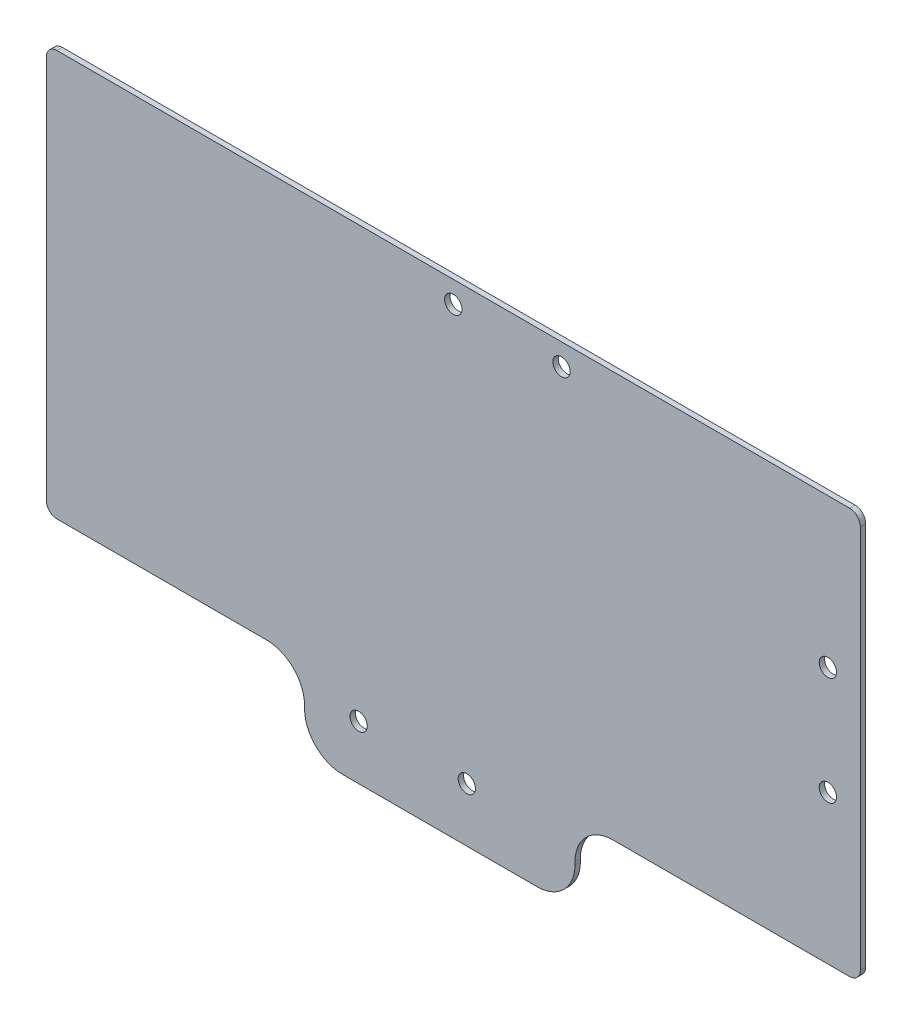
ISO-10303-21;
HEADER;
FILE_DESCRIPTION(('STEP AP214'),'2;1');
FILE_NAME('part.step','',(''),(''),'','','');
FILE_SCHEMA(('AUTOMOTIVE_DESIGN { 1 0 10303 214 1 1 1 1 }'));
ENDSEC;
DATA;
#1=APPLICATION_CONTEXT('core data for automotive mechanical design processes');
#2=APPLICATION_PROTOCOL_DEFINITION('international standard','automotive_design',2000,#1);
#3=PRODUCT_CONTEXT('',#1,'mechanical');
#4=PRODUCT('Part','Part','',(#3));
#5=PRODUCT_RELATED_PRODUCT_CATEGORY('part','',(#4));
#6=PRODUCT_DEFINITION_FORMATION('','',#4);
#7=PRODUCT_DEFINITION_CONTEXT('part definition',#1,'design');
#8=PRODUCT_DEFINITION('design','',#6,#7);
#9=PRODUCT_DEFINITION_SHAPE('','',#8);
#10=(LENGTH_UNIT() NAMED_UNIT(*) SI_UNIT(.MILLI.,.METRE.));
#11=(NAMED_UNIT(*) PLANE_ANGLE_UNIT() SI_UNIT($,.RADIAN.));
#12=(NAMED_UNIT(*) SI_UNIT($,.STERADIAN.) SOLID_ANGLE_UNIT());
#13=UNCERTAINTY_MEASURE_WITH_UNIT(LENGTH_MEASURE(1.E-05),#10,'distance_accuracy_value','');
#14=(GEOMETRIC_REPRESENTATION_CONTEXT(3) GLOBAL_UNCERTAINTY_ASSIGNED_CONTEXT((#13)) GLOBAL_UNIT_ASSIGNED_CONTEXT((#10,
#11,#12)) REPRESENTATION_CONTEXT('',''));
#15=CARTESIAN_POINT('',(0.,0.,0.));
#16=DIRECTION('',(0.,0.,1.));
#17=DIRECTION('',(1.,0.,0.));
#18=AXIS2_PLACEMENT_3D('',#15,#16,#17);
#19=CARTESIAN_POINT('',(0.,0.,1.));
#20=DIRECTION('',(0.,0.,-1.));
#21=DIRECTION('',(-1.,0.,0.));
#22=AXIS2_PLACEMENT_3D('',#19,#20,#21);
#23=PLANE('',#22);
#24=CARTESIAN_POINT('',(27.5,75.5,0.999999999999999));
#25=DIRECTION('',(0.,0.,-1.));
#26=DIRECTION('',(-1.,0.,0.));
#27=AXIS2_PLACEMENT_3D('',#24,#25,#26);
#28=CIRCLE('',#27,1.60000000000001);
#29=CARTESIAN_POINT('',(25.9,75.5,0.999999999999999));
#30=VERTEX_POINT('',#29);
#31=EDGE_CURVE('E355',#30,#30,#28,.T.);
#32=ORIENTED_EDGE('',*,*,#31,.T.);
#33=EDGE_LOOP('',(#32));
#34=FACE_BOUND('',#33,.T.);
#35=CARTESIAN_POINT('',(7.49999999999999,75.5,0.999999999999999));
#36=DIRECTION('',(0.,0.,-1.));
#37=DIRECTION('',(-1.,0.,0.));
#38=AXIS2_PLACEMENT_3D('',#35,#36,#37);
#39=CIRCLE('',#38,1.6);
#40=CARTESIAN_POINT('',(5.89999999999999,75.5,0.999999999999999));
#41=VERTEX_POINT('',#40);
#42=EDGE_CURVE('E359',#41,#41,#39,.T.);
#43=ORIENTED_EDGE('',*,*,#42,.T.);
#44=EDGE_LOOP('',(#43));
#45=FACE_BOUND('',#44,.T.);
#46=DIRECTION('',(0.,-1.,0.));
#47=VECTOR('',#46,1.);
#48=CARTESIAN_POINT('',(-67.75,79.5,1.));
#49=LINE('',#48,#47);
#50=CARTESIAN_POINT('',(-67.75,77.5,1.));
#51=VERTEX_POINT('',#50);
#52=CARTESIAN_POINT('',(-67.75,6.50000000000001,1.));
#53=VERTEX_POINT('',#52);
#54=EDGE_CURVE('E366',#51,#53,#49,.T.);
#55=ORIENTED_EDGE('',*,*,#54,.T.);
#56=CARTESIAN_POINT('',(-65.75,6.5,1.));
#57=DIRECTION('',(0.,0.,-1.));
#58=DIRECTION('',(-1.,0.,0.));
#59=AXIS2_PLACEMENT_3D('',#56,#57,#58);
#60=CIRCLE('',#59,2.);
#61=CARTESIAN_POINT('',(-65.75,4.5,1.));
#62=VERTEX_POINT('',#61);
#63=EDGE_CURVE('E236',#53,#62,#60,.F.);
#64=ORIENTED_EDGE('',*,*,#63,.T.);
#65=DIRECTION('',(-1.,0.,0.));
#66=VECTOR('',#65,1.);
#67=CARTESIAN_POINT('',(82.75,4.5,1.));
#68=LINE('',#67,#66);
#69=CARTESIAN_POINT('',(-27.,4.5,1.));
#70=VERTEX_POINT('',#69);
#71=EDGE_CURVE('E258',#70,#62,#68,.T.);
#72=ORIENTED_EDGE('',*,*,#71,.F.);
#73=CARTESIAN_POINT('',(-27.,-2.5,0.999999999999999));
#74=DIRECTION('',(0.,0.,-1.));
#75=DIRECTION('',(-1.,0.,0.));
#76=AXIS2_PLACEMENT_3D('',#73,#74,#75);
#77=CIRCLE('',#76,7.);
#78=CARTESIAN_POINT('',(-20.,-2.5,1.));
#79=VERTEX_POINT('',#78);
#80=EDGE_CURVE('E213',#70,#79,#77,.T.);
#81=ORIENTED_EDGE('',*,*,#80,.T.);
#82=DIRECTION('',(0.,-1.,0.));
#83=VECTOR('',#82,1.);
#84=CARTESIAN_POINT('',(-20.,0.,1.));
#85=LINE('',#84,#83);
#86=CARTESIAN_POINT('',(-20.,-3.,1.));
#87=VERTEX_POINT('',#86);
#88=EDGE_CURVE('E289',#79,#87,#85,.T.);
#89=ORIENTED_EDGE('',*,*,#88,.T.);
#90=CARTESIAN_POINT('',(-13.,-3.,1.));
#91=DIRECTION('',(0.,0.,-1.));
#92=DIRECTION('',(-1.,0.,0.));
#93=AXIS2_PLACEMENT_3D('',#90,#91,#92);
#94=CIRCLE('',#93,7.);
#95=CARTESIAN_POINT('',(-13.,-10.,1.));
#96=VERTEX_POINT('',#95);
#97=EDGE_CURVE('E207',#87,#96,#94,.F.);
#98=ORIENTED_EDGE('',*,*,#97,.T.);
#99=DIRECTION('',(1.,0.,0.));
#100=VECTOR('',#99,1.);
#101=CARTESIAN_POINT('',(-30.,-10.,1.));
#102=LINE('',#101,#100);
#103=CARTESIAN_POINT('',(23.,-10.,1.));
#104=VERTEX_POINT('',#103);
#105=EDGE_CURVE('E183',#96,#104,#102,.T.);
#106=ORIENTED_EDGE('',*,*,#105,.T.);
#107=CARTESIAN_POINT('',(23.,-3.,1.));
#108=DIRECTION('',(0.,0.,-1.));
#109=DIRECTION('',(-1.,0.,0.));
#110=AXIS2_PLACEMENT_3D('',#107,#108,#109);
#111=CIRCLE('',#110,7.);
#112=CARTESIAN_POINT('',(30.,-3.,1.));
#113=VERTEX_POINT('',#112);
#114=EDGE_CURVE('E188',#104,#113,#111,.F.);
#115=ORIENTED_EDGE('',*,*,#114,.T.);
#116=DIRECTION('',(0.,1.,0.));
#117=VECTOR('',#116,1.);
#118=CARTESIAN_POINT('',(30.,-10.,1.));
#119=LINE('',#118,#117);
#120=CARTESIAN_POINT('',(30.,-2.5,1.));
#121=VERTEX_POINT('',#120);
#122=EDGE_CURVE('E167',#113,#121,#119,.T.);
#123=ORIENTED_EDGE('',*,*,#122,.T.);
#124=CARTESIAN_POINT('',(37.,-2.5,1.));
#125=DIRECTION('',(0.,0.,-1.));
#126=DIRECTION('',(-1.,0.,0.));
#127=AXIS2_PLACEMENT_3D('',#124,#125,#126);
#128=CIRCLE('',#127,7.);
#129=CARTESIAN_POINT('',(37.,4.5,1.));
#130=VERTEX_POINT('',#129);
#131=EDGE_CURVE('E194',#121,#130,#128,.T.);
#132=ORIENTED_EDGE('',*,*,#131,.T.);
#133=CARTESIAN_POINT('',(80.75,4.5,1.));
#134=VERTEX_POINT('',#133);
#135=EDGE_CURVE('E330',#134,#130,#68,.T.);
#136=ORIENTED_EDGE('',*,*,#135,.F.);
#137=CARTESIAN_POINT('',(80.75,6.5,1.));
#138=DIRECTION('',(0.,0.,-1.));
#139=DIRECTION('',(-1.,0.,0.));
#140=AXIS2_PLACEMENT_3D('',#137,#138,#139);
#141=CIRCLE('',#140,2.);
#142=CARTESIAN_POINT('',(82.75,6.5,1.));
#143=VERTEX_POINT('',#142);
#144=EDGE_CURVE('E234',#134,#143,#141,.F.);
#145=ORIENTED_EDGE('',*,*,#144,.T.);
#146=DIRECTION('',(0.,-1.,0.));
#147=VECTOR('',#146,1.);
#148=CARTESIAN_POINT('',(82.75,4.5,1.));
#149=LINE('',#148,#147);
#150=CARTESIAN_POINT('',(82.75,77.5,1.));
#151=VERTEX_POINT('',#150);
#152=EDGE_CURVE('E254',#151,#143,#149,.T.);
#153=ORIENTED_EDGE('',*,*,#152,.F.);
#154=CARTESIAN_POINT('',(80.75,77.5,1.));
#155=DIRECTION('',(0.,0.,-1.));
#156=DIRECTION('',(-1.,0.,0.));
#157=AXIS2_PLACEMENT_3D('',#154,#155,#156);
#158=CIRCLE('',#157,2.);
#159=CARTESIAN_POINT('',(80.75,79.5,1.));
#160=VERTEX_POINT('',#159);
#161=EDGE_CURVE('E50',#151,#160,#158,.F.);
#162=ORIENTED_EDGE('',*,*,#161,.T.);
#163=DIRECTION('',(1.,0.,0.));
#164=VECTOR('',#163,1.);
#165=CARTESIAN_POINT('',(82.75,79.5,1.));
#166=LINE('',#165,#164);
#167=CARTESIAN_POINT('',(-65.75,79.5,1.));
#168=VERTEX_POINT('',#167);
#169=EDGE_CURVE('E249',#168,#160,#166,.T.);
#170=ORIENTED_EDGE('',*,*,#169,.F.);
#171=CARTESIAN_POINT('',(-65.75,77.5,1.));
#172=DIRECTION('',(0.,0.,-1.));
#173=DIRECTION('',(-1.,0.,0.));
#174=AXIS2_PLACEMENT_3D('',#171,#172,#173);
#175=CIRCLE('',#174,2.);
#176=EDGE_CURVE('E232',#168,#51,#175,.F.);
#177=ORIENTED_EDGE('',*,*,#176,.T.);
#178=EDGE_LOOP('',(#55,#64,#72,#81,#89,#98,#106,#115,#123,#132,#136,#145,#153,#162,#170,#177));
#179=FACE_BOUND('',#178,.T.);
#180=CARTESIAN_POINT('',(-10.,0.,1.));
#181=DIRECTION('',(0.,0.,1.));
#182=DIRECTION('',(1.,0.,0.));
#183=AXIS2_PLACEMENT_3D('',#180,#181,#182);
#184=CIRCLE('',#183,1.6);
#185=CARTESIAN_POINT('',(-8.4,0.,1.));
#186=VERTEX_POINT('',#185);
#187=EDGE_CURVE('E176',#186,#186,#184,.T.);
#188=ORIENTED_EDGE('',*,*,#187,.F.);
#189=EDGE_LOOP('',(#188));
#190=FACE_BOUND('',#189,.T.);
#191=CARTESIAN_POINT('',(10.,0.,1.));
#192=DIRECTION('',(0.,0.,1.));
#193=DIRECTION('',(1.,0.,0.));
#194=AXIS2_PLACEMENT_3D('',#191,#192,#193);
#195=CIRCLE('',#194,1.6);
#196=CARTESIAN_POINT('',(11.6,0.,1.));
#197=VERTEX_POINT('',#196);
#198=EDGE_CURVE('E264',#197,#197,#195,.T.);
#199=ORIENTED_EDGE('',*,*,#198,.F.);
#200=EDGE_LOOP('',(#199));
#201=FACE_BOUND('',#200,.T.);
#202=CARTESIAN_POINT('',(76.75,32.,1.));
#203=DIRECTION('',(0.,0.,-1.));
#204=DIRECTION('',(-1.,0.,0.));
#205=AXIS2_PLACEMENT_3D('',#202,#203,#204);
#206=CIRCLE('',#205,1.60000000000001);
#207=CARTESIAN_POINT('',(75.15,32.,1.));
#208=VERTEX_POINT('',#207);
#209=EDGE_CURVE('E350',#208,#208,#206,.T.);
#210=ORIENTED_EDGE('',*,*,#209,.T.);
#211=EDGE_LOOP('',(#210));
#212=FACE_BOUND('',#211,.T.);
#213=CARTESIAN_POINT('',(76.75,52.,1.));
#214=DIRECTION('',(0.,0.,-1.));
#215=DIRECTION('',(-1.,0.,0.));
#216=AXIS2_PLACEMENT_3D('',#213,#214,#215);
#217=CIRCLE('',#216,1.60000000000001);
#218=CARTESIAN_POINT('',(75.15,52.,1.));
#219=VERTEX_POINT('',#218);
#220=EDGE_CURVE('E343',#219,#219,#217,.T.);
#221=ORIENTED_EDGE('',*,*,#220,.T.);
#222=EDGE_LOOP('',(#221));
#223=FACE_BOUND('',#222,.T.);
#224=ADVANCED_FACE('F35',(#34,#45,#179,#190,#201,#212,#223),#23,.F.);
#225=CARTESIAN_POINT('',(0.,0.,0.));
#226=DIRECTION('',(0.,0.,-1.));
#227=DIRECTION('',(-1.,0.,0.));
#228=AXIS2_PLACEMENT_3D('',#225,#226,#227);
#229=PLANE('',#228);
#230=DIRECTION('',(-1.,0.,0.));
#231=VECTOR('',#230,1.);
#232=CARTESIAN_POINT('',(82.75,4.5,0.));
#233=LINE('',#232,#231);
#234=CARTESIAN_POINT('',(-27.,4.5,0.));
#235=VERTEX_POINT('',#234);
#236=CARTESIAN_POINT('',(-65.75,4.5,0.));
#237=VERTEX_POINT('',#236);
#238=EDGE_CURVE('E260',#235,#237,#233,.T.);
#239=ORIENTED_EDGE('',*,*,#238,.T.);
#240=CARTESIAN_POINT('',(-65.75,6.5,0.));
#241=DIRECTION('',(0.,0.,-1.));
#242=DIRECTION('',(-1.,0.,0.));
#243=AXIS2_PLACEMENT_3D('',#240,#241,#242);
#244=CIRCLE('',#243,2.);
#245=CARTESIAN_POINT('',(-67.75,6.50000000000001,0.));
#246=VERTEX_POINT('',#245);
#247=EDGE_CURVE('E224',#237,#246,#244,.T.);
#248=ORIENTED_EDGE('',*,*,#247,.T.);
#249=DIRECTION('',(0.,1.,0.));
#250=VECTOR('',#249,1.);
#251=CARTESIAN_POINT('',(-67.75,79.5,0.));
#252=LINE('',#251,#250);
#253=CARTESIAN_POINT('',(-67.75,77.5,0.));
#254=VERTEX_POINT('',#253);
#255=EDGE_CURVE('E369',#246,#254,#252,.T.);
#256=ORIENTED_EDGE('',*,*,#255,.T.);
#257=CARTESIAN_POINT('',(-65.75,77.5,0.));
#258=DIRECTION('',(0.,0.,-1.));
#259=DIRECTION('',(-1.,0.,0.));
#260=AXIS2_PLACEMENT_3D('',#257,#258,#259);
#261=CIRCLE('',#260,2.);
#262=CARTESIAN_POINT('',(-65.75,79.5,0.));
#263=VERTEX_POINT('',#262);
#264=EDGE_CURVE('E220',#254,#263,#261,.T.);
#265=ORIENTED_EDGE('',*,*,#264,.T.);
#266=DIRECTION('',(1.,0.,0.));
#267=VECTOR('',#266,1.);
#268=CARTESIAN_POINT('',(82.75,79.5,0.));
#269=LINE('',#268,#267);
#270=CARTESIAN_POINT('',(80.75,79.5,0.));
#271=VERTEX_POINT('',#270);
#272=EDGE_CURVE('E248',#263,#271,#269,.T.);
#273=ORIENTED_EDGE('',*,*,#272,.T.);
#274=CARTESIAN_POINT('',(80.75,77.5,0.));
#275=DIRECTION('',(0.,0.,-1.));
#276=DIRECTION('',(-1.,0.,0.));
#277=AXIS2_PLACEMENT_3D('',#274,#275,#276);
#278=CIRCLE('',#277,2.);
#279=CARTESIAN_POINT('',(82.75,77.5,0.));
#280=VERTEX_POINT('',#279);
#281=EDGE_CURVE('E218',#271,#280,#278,.T.);
#282=ORIENTED_EDGE('',*,*,#281,.T.);
#283=DIRECTION('',(0.,-1.,0.));
#284=VECTOR('',#283,1.);
#285=CARTESIAN_POINT('',(82.75,4.5,0.));
#286=LINE('',#285,#284);
#287=CARTESIAN_POINT('',(82.75,6.5,0.));
#288=VERTEX_POINT('',#287);
#289=EDGE_CURVE('E340',#280,#288,#286,.T.);
#290=ORIENTED_EDGE('',*,*,#289,.T.);
#291=CARTESIAN_POINT('',(80.75,6.5,0.));
#292=DIRECTION('',(0.,0.,-1.));
#293=DIRECTION('',(-1.,0.,0.));
#294=AXIS2_PLACEMENT_3D('',#291,#292,#293);
#295=CIRCLE('',#294,2.);
#296=CARTESIAN_POINT('',(80.75,4.5,0.));
#297=VERTEX_POINT('',#296);
#298=EDGE_CURVE('E222',#288,#297,#295,.T.);
#299=ORIENTED_EDGE('',*,*,#298,.T.);
#300=CARTESIAN_POINT('',(37.,4.5,0.));
#301=VERTEX_POINT('',#300);
#302=EDGE_CURVE('E255',#297,#301,#233,.T.);
#303=ORIENTED_EDGE('',*,*,#302,.T.);
#304=CARTESIAN_POINT('',(37.,-2.5,0.));
#305=DIRECTION('',(0.,0.,-1.));
#306=DIRECTION('',(-1.,0.,0.));
#307=AXIS2_PLACEMENT_3D('',#304,#305,#306);
#308=CIRCLE('',#307,7.);
#309=CARTESIAN_POINT('',(30.,-2.5,0.));
#310=VERTEX_POINT('',#309);
#311=EDGE_CURVE('E174',#301,#310,#308,.F.);
#312=ORIENTED_EDGE('',*,*,#311,.T.);
#313=DIRECTION('',(0.,1.,0.));
#314=VECTOR('',#313,1.);
#315=CARTESIAN_POINT('',(30.,-10.,0.));
#316=LINE('',#315,#314);
#317=CARTESIAN_POINT('',(30.,-3.,0.));
#318=VERTEX_POINT('',#317);
#319=EDGE_CURVE('E164',#318,#310,#316,.T.);
#320=ORIENTED_EDGE('',*,*,#319,.F.);
#321=CARTESIAN_POINT('',(23.,-3.,0.));
#322=DIRECTION('',(0.,0.,-1.));
#323=DIRECTION('',(-1.,0.,0.));
#324=AXIS2_PLACEMENT_3D('',#321,#322,#323);
#325=CIRCLE('',#324,7.);
#326=CARTESIAN_POINT('',(23.,-10.,0.));
#327=VERTEX_POINT('',#326);
#328=EDGE_CURVE('E149',#318,#327,#325,.T.);
#329=ORIENTED_EDGE('',*,*,#328,.T.);
#330=DIRECTION('',(1.,0.,0.));
#331=VECTOR('',#330,1.);
#332=CARTESIAN_POINT('',(-30.,-10.,0.));
#333=LINE('',#332,#331);
#334=CARTESIAN_POINT('',(-13.,-10.,0.));
#335=VERTEX_POINT('',#334);
#336=EDGE_CURVE('E175',#335,#327,#333,.T.);
#337=ORIENTED_EDGE('',*,*,#336,.F.);
#338=CARTESIAN_POINT('',(-13.,-3.,0.));
#339=DIRECTION('',(0.,0.,-1.));
#340=DIRECTION('',(-1.,0.,0.));
#341=AXIS2_PLACEMENT_3D('',#338,#339,#340);
#342=CIRCLE('',#341,7.);
#343=CARTESIAN_POINT('',(-20.,-3.,0.));
#344=VERTEX_POINT('',#343);
#345=EDGE_CURVE('E200',#335,#344,#342,.T.);
#346=ORIENTED_EDGE('',*,*,#345,.T.);
#347=DIRECTION('',(0.,-1.,0.));
#348=VECTOR('',#347,1.);
#349=CARTESIAN_POINT('',(-20.,4.5,0.));
#350=LINE('',#349,#348);
#351=CARTESIAN_POINT('',(-20.,-2.5,0.));
#352=VERTEX_POINT('',#351);
#353=EDGE_CURVE('E282',#352,#344,#350,.T.);
#354=ORIENTED_EDGE('',*,*,#353,.F.);
#355=CARTESIAN_POINT('',(-27.,-2.5,0.));
#356=DIRECTION('',(0.,0.,-1.));
#357=DIRECTION('',(-1.,0.,0.));
#358=AXIS2_PLACEMENT_3D('',#355,#356,#357);
#359=CIRCLE('',#358,7.);
#360=EDGE_CURVE('E211',#352,#235,#359,.F.);
#361=ORIENTED_EDGE('',*,*,#360,.T.);
#362=EDGE_LOOP('',(#239,#248,#256,#265,#273,#282,#290,#299,#303,#312,#320,#329,#337,#346,#354,#361));
#363=FACE_BOUND('',#362,.T.);
#364=CARTESIAN_POINT('',(27.5,75.5,0.));
#365=DIRECTION('',(0.,0.,-1.));
#366=DIRECTION('',(-1.,0.,0.));
#367=AXIS2_PLACEMENT_3D('',#364,#365,#366);
#368=CIRCLE('',#367,1.60000000000001);
#369=CARTESIAN_POINT('',(25.9,75.5,0.));
#370=VERTEX_POINT('',#369);
#371=EDGE_CURVE('E362',#370,#370,#368,.T.);
#372=ORIENTED_EDGE('',*,*,#371,.F.);
#373=EDGE_LOOP('',(#372));
#374=FACE_BOUND('',#373,.T.);
#375=CARTESIAN_POINT('',(7.49999999999999,75.5,0.));
#376=DIRECTION('',(0.,0.,-1.));
#377=DIRECTION('',(-1.,0.,0.));
#378=AXIS2_PLACEMENT_3D('',#375,#376,#377);
#379=CIRCLE('',#378,1.6);
#380=CARTESIAN_POINT('',(5.89999999999999,75.5,0.));
#381=VERTEX_POINT('',#380);
#382=EDGE_CURVE('E363',#381,#381,#379,.T.);
#383=ORIENTED_EDGE('',*,*,#382,.F.);
#384=EDGE_LOOP('',(#383));
#385=FACE_BOUND('',#384,.T.);
#386=CARTESIAN_POINT('',(-10.,0.,0.));
#387=DIRECTION('',(0.,0.,1.));
#388=DIRECTION('',(1.,0.,0.));
#389=AXIS2_PLACEMENT_3D('',#386,#387,#388);
#390=CIRCLE('',#389,1.6);
#391=CARTESIAN_POINT('',(-8.4,0.,0.));
#392=VERTEX_POINT('',#391);
#393=EDGE_CURVE('E180',#392,#392,#390,.T.);
#394=ORIENTED_EDGE('',*,*,#393,.T.);
#395=EDGE_LOOP('',(#394));
#396=FACE_BOUND('',#395,.T.);
#397=CARTESIAN_POINT('',(10.,0.,0.));
#398=DIRECTION('',(0.,0.,1.));
#399=DIRECTION('',(1.,0.,0.));
#400=AXIS2_PLACEMENT_3D('',#397,#398,#399);
#401=CIRCLE('',#400,1.6);
#402=CARTESIAN_POINT('',(11.6,0.,0.));
#403=VERTEX_POINT('',#402);
#404=EDGE_CURVE('E267',#403,#403,#401,.T.);
#405=ORIENTED_EDGE('',*,*,#404,.T.);
#406=EDGE_LOOP('',(#405));
#407=FACE_BOUND('',#406,.T.);
#408=CARTESIAN_POINT('',(76.75,32.,0.));
#409=DIRECTION('',(0.,0.,-1.));
#410=DIRECTION('',(-1.,0.,0.));
#411=AXIS2_PLACEMENT_3D('',#408,#409,#410);
#412=CIRCLE('',#411,1.60000000000001);
#413=CARTESIAN_POINT('',(75.15,32.,0.));
#414=VERTEX_POINT('',#413);
#415=EDGE_CURVE('E352',#414,#414,#412,.T.);
#416=ORIENTED_EDGE('',*,*,#415,.F.);
#417=EDGE_LOOP('',(#416));
#418=FACE_BOUND('',#417,.T.);
#419=CARTESIAN_POINT('',(76.75,52.,0.));
#420=DIRECTION('',(0.,0.,-1.));
#421=DIRECTION('',(-1.,0.,0.));
#422=AXIS2_PLACEMENT_3D('',#419,#420,#421);
#423=CIRCLE('',#422,1.60000000000001);
#424=CARTESIAN_POINT('',(75.15,52.,0.));
#425=VERTEX_POINT('',#424);
#426=EDGE_CURVE('E345',#425,#425,#423,.T.);
#427=ORIENTED_EDGE('',*,*,#426,.F.);
#428=EDGE_LOOP('',(#427));
#429=FACE_BOUND('',#428,.T.);
#430=ADVANCED_FACE('F171',(#363,#374,#385,#396,#407,#418,#429),#229,.T.);
#431=CARTESIAN_POINT('',(30.,-10.,1.));
#432=DIRECTION('',(-1.,0.,0.));
#433=DIRECTION('',(0.,-1.,0.));
#434=AXIS2_PLACEMENT_3D('',#431,#432,#433);
#435=PLANE('',#434);
#436=ORIENTED_EDGE('',*,*,#122,.F.);
#437=DIRECTION('',(0.,0.,-1.));
#438=VECTOR('',#437,1.);
#439=CARTESIAN_POINT('',(30.,-3.,1.));
#440=LINE('',#439,#438);
#441=EDGE_CURVE('E153',#113,#318,#440,.T.);
#442=ORIENTED_EDGE('',*,*,#441,.T.);
#443=ORIENTED_EDGE('',*,*,#319,.T.);
#444=DIRECTION('',(0.,0.,-1.));
#445=VECTOR('',#444,1.);
#446=CARTESIAN_POINT('',(30.,-2.5,1.));
#447=LINE('',#446,#445);
#448=EDGE_CURVE('E168',#310,#121,#447,.F.);
#449=ORIENTED_EDGE('',*,*,#448,.T.);
#450=EDGE_LOOP('',(#436,#442,#443,#449));
#451=FACE_BOUND('',#450,.T.);
#452=ADVANCED_FACE('F163',(#451),#435,.F.);
#453=CARTESIAN_POINT('',(-30.,-10.,1.));
#454=DIRECTION('',(0.,1.,0.));
#455=DIRECTION('',(0.,0.,1.));
#456=AXIS2_PLACEMENT_3D('',#453,#454,#455);
#457=PLANE('',#456);
#458=ORIENTED_EDGE('',*,*,#105,.F.);
#459=DIRECTION('',(0.,0.,-1.));
#460=VECTOR('',#459,1.);
#461=CARTESIAN_POINT('',(-13.,-10.,1.));
#462=LINE('',#461,#460);
#463=EDGE_CURVE('E197',#96,#335,#462,.T.);
#464=ORIENTED_EDGE('',*,*,#463,.T.);
#465=ORIENTED_EDGE('',*,*,#336,.T.);
#466=DIRECTION('',(0.,0.,-1.));
#467=VECTOR('',#466,1.);
#468=CARTESIAN_POINT('',(23.,-10.,1.));
#469=LINE('',#468,#467);
#470=EDGE_CURVE('E155',#327,#104,#469,.F.);
#471=ORIENTED_EDGE('',*,*,#470,.T.);
#472=EDGE_LOOP('',(#458,#464,#465,#471));
#473=FACE_BOUND('',#472,.T.);
#474=ADVANCED_FACE('F279',(#473),#457,.F.);
#475=CARTESIAN_POINT('',(-10.,0.,1.));
#476=DIRECTION('',(0.,0.,-1.));
#477=DIRECTION('',(-1.,0.,0.));
#478=AXIS2_PLACEMENT_3D('',#475,#476,#477);
#479=CYLINDRICAL_SURFACE('',#478,1.6);
#480=ORIENTED_EDGE('',*,*,#187,.T.);
#481=EDGE_LOOP('',(#480));
#482=FACE_BOUND('',#481,.T.);
#483=ORIENTED_EDGE('',*,*,#393,.F.);
#484=EDGE_LOOP('',(#483));
#485=FACE_BOUND('',#484,.T.);
#486=ADVANCED_FACE('F315',(#482,#485),#479,.F.);
#487=CARTESIAN_POINT('',(10.,0.,1.));
#488=DIRECTION('',(0.,0.,-1.));
#489=DIRECTION('',(-1.,0.,0.));
#490=AXIS2_PLACEMENT_3D('',#487,#488,#489);
#491=CYLINDRICAL_SURFACE('',#490,1.6);
#492=ORIENTED_EDGE('',*,*,#198,.T.);
#493=EDGE_LOOP('',(#492));
#494=FACE_BOUND('',#493,.T.);
#495=ORIENTED_EDGE('',*,*,#404,.F.);
#496=EDGE_LOOP('',(#495));
#497=FACE_BOUND('',#496,.T.);
#498=ADVANCED_FACE('F444',(#494,#497),#491,.F.);
#499=CARTESIAN_POINT('',(82.75,4.5,1.));
#500=DIRECTION('',(0.,-1.,0.));
#501=DIRECTION('',(0.,0.,-1.));
#502=AXIS2_PLACEMENT_3D('',#499,#500,#501);
#503=PLANE('',#502);
#504=ORIENTED_EDGE('',*,*,#71,.T.);
#505=DIRECTION('',(0.,0.,-1.));
#506=VECTOR('',#505,1.);
#507=CARTESIAN_POINT('',(-65.75,4.5,1.));
#508=LINE('',#507,#506);
#509=EDGE_CURVE('E215',#62,#237,#508,.T.);
#510=ORIENTED_EDGE('',*,*,#509,.T.);
#511=ORIENTED_EDGE('',*,*,#238,.F.);
#512=DIRECTION('',(0.,0.,-1.));
#513=VECTOR('',#512,1.);
#514=CARTESIAN_POINT('',(-27.,4.5,1.));
#515=LINE('',#514,#513);
#516=EDGE_CURVE('E209',#235,#70,#515,.F.);
#517=ORIENTED_EDGE('',*,*,#516,.T.);
#518=EDGE_LOOP('',(#504,#510,#511,#517));
#519=FACE_BOUND('',#518,.T.);
#520=ADVANCED_FACE('F378',(#519),#503,.T.);
#521=CARTESIAN_POINT('',(82.75,4.5,1.));
#522=DIRECTION('',(1.,0.,0.));
#523=DIRECTION('',(0.,0.,-1.));
#524=AXIS2_PLACEMENT_3D('',#521,#522,#523);
#525=PLANE('',#524);
#526=ORIENTED_EDGE('',*,*,#152,.T.);
#527=DIRECTION('',(0.,0.,-1.));
#528=VECTOR('',#527,1.);
#529=CARTESIAN_POINT('',(82.75,6.5,1.));
#530=LINE('',#529,#528);
#531=EDGE_CURVE('E240',#143,#288,#530,.T.);
#532=ORIENTED_EDGE('',*,*,#531,.T.);
#533=ORIENTED_EDGE('',*,*,#289,.F.);
#534=DIRECTION('',(0.,0.,-1.));
#535=VECTOR('',#534,1.);
#536=CARTESIAN_POINT('',(82.75,77.5,1.));
#537=LINE('',#536,#535);
#538=EDGE_CURVE('E238',#280,#151,#537,.F.);
#539=ORIENTED_EDGE('',*,*,#538,.T.);
#540=EDGE_LOOP('',(#526,#532,#533,#539));
#541=FACE_BOUND('',#540,.T.);
#542=ADVANCED_FACE('F339',(#541),#525,.T.);
#543=CARTESIAN_POINT('',(82.75,79.5,1.));
#544=DIRECTION('',(0.,1.,0.));
#545=DIRECTION('',(-1.,0.,0.));
#546=AXIS2_PLACEMENT_3D('',#543,#544,#545);
#547=PLANE('',#546);
#548=ORIENTED_EDGE('',*,*,#272,.F.);
#549=DIRECTION('',(0.,0.,-1.));
#550=VECTOR('',#549,1.);
#551=CARTESIAN_POINT('',(-65.75,79.5,1.));
#552=LINE('',#551,#550);
#553=EDGE_CURVE('E11',#263,#168,#552,.F.);
#554=ORIENTED_EDGE('',*,*,#553,.T.);
#555=ORIENTED_EDGE('',*,*,#169,.T.);
#556=DIRECTION('',(0.,0.,-1.));
#557=VECTOR('',#556,1.);
#558=CARTESIAN_POINT('',(80.75,79.5,1.));
#559=LINE('',#558,#557);
#560=EDGE_CURVE('E43',#160,#271,#559,.T.);
#561=ORIENTED_EDGE('',*,*,#560,.T.);
#562=EDGE_LOOP('',(#548,#554,#555,#561));
#563=FACE_BOUND('',#562,.T.);
#564=ADVANCED_FACE('F247',(#563),#547,.T.);
#565=ORIENTED_EDGE('',*,*,#302,.F.);
#566=DIRECTION('',(0.,0.,-1.));
#567=VECTOR('',#566,1.);
#568=CARTESIAN_POINT('',(80.75,4.5,1.));
#569=LINE('',#568,#567);
#570=EDGE_CURVE('E243',#297,#134,#569,.F.);
#571=ORIENTED_EDGE('',*,*,#570,.T.);
#572=ORIENTED_EDGE('',*,*,#135,.T.);
#573=DIRECTION('',(0.,0.,-1.));
#574=VECTOR('',#573,1.);
#575=CARTESIAN_POINT('',(37.,4.5,1.));
#576=LINE('',#575,#574);
#577=EDGE_CURVE('E190',#130,#301,#576,.T.);
#578=ORIENTED_EDGE('',*,*,#577,.T.);
#579=EDGE_LOOP('',(#565,#571,#572,#578));
#580=FACE_BOUND('',#579,.T.);
#581=ADVANCED_FACE('F446',(#580),#503,.T.);
#582=CARTESIAN_POINT('',(76.75,52.,1.));
#583=DIRECTION('',(0.,0.,-1.));
#584=DIRECTION('',(-1.,0.,0.));
#585=AXIS2_PLACEMENT_3D('',#582,#583,#584);
#586=CYLINDRICAL_SURFACE('',#585,1.60000000000001);
#587=ORIENTED_EDGE('',*,*,#220,.F.);
#588=EDGE_LOOP('',(#587));
#589=FACE_BOUND('',#588,.T.);
#590=ORIENTED_EDGE('',*,*,#426,.T.);
#591=EDGE_LOOP('',(#590));
#592=FACE_BOUND('',#591,.T.);
#593=ADVANCED_FACE('F488',(#589,#592),#586,.F.);
#594=CARTESIAN_POINT('',(76.75,32.,1.));
#595=DIRECTION('',(0.,0.,-1.));
#596=DIRECTION('',(-1.,0.,0.));
#597=AXIS2_PLACEMENT_3D('',#594,#595,#596);
#598=CYLINDRICAL_SURFACE('',#597,1.60000000000001);
#599=ORIENTED_EDGE('',*,*,#209,.F.);
#600=EDGE_LOOP('',(#599));
#601=FACE_BOUND('',#600,.T.);
#602=ORIENTED_EDGE('',*,*,#415,.T.);
#603=EDGE_LOOP('',(#602));
#604=FACE_BOUND('',#603,.T.);
#605=ADVANCED_FACE('F497',(#601,#604),#598,.F.);
#606=CARTESIAN_POINT('',(7.49999999999999,75.5,10.));
#607=DIRECTION('',(0.,0.,-1.));
#608=DIRECTION('',(-1.,0.,0.));
#609=AXIS2_PLACEMENT_3D('',#606,#607,#608);
#610=CYLINDRICAL_SURFACE('',#609,1.6);
#611=ORIENTED_EDGE('',*,*,#382,.T.);
#612=EDGE_LOOP('',(#611));
#613=FACE_BOUND('',#612,.T.);
#614=ORIENTED_EDGE('',*,*,#42,.F.);
#615=EDGE_LOOP('',(#614));
#616=FACE_BOUND('',#615,.T.);
#617=ADVANCED_FACE('F505',(#613,#616),#610,.F.);
#618=CARTESIAN_POINT('',(27.5,75.5,10.));
#619=DIRECTION('',(0.,0.,-1.));
#620=DIRECTION('',(-1.,0.,0.));
#621=AXIS2_PLACEMENT_3D('',#618,#619,#620);
#622=CYLINDRICAL_SURFACE('',#621,1.60000000000001);
#623=ORIENTED_EDGE('',*,*,#371,.T.);
#624=EDGE_LOOP('',(#623));
#625=FACE_BOUND('',#624,.T.);
#626=ORIENTED_EDGE('',*,*,#31,.F.);
#627=EDGE_LOOP('',(#626));
#628=FACE_BOUND('',#627,.T.);
#629=ADVANCED_FACE('F468',(#625,#628),#622,.F.);
#630=CARTESIAN_POINT('',(-67.75,79.5,81.7774721070176));
#631=DIRECTION('',(-1.,0.,0.));
#632=DIRECTION('',(0.,-1.,0.));
#633=AXIS2_PLACEMENT_3D('',#630,#631,#632);
#634=PLANE('',#633);
#635=ORIENTED_EDGE('',*,*,#255,.F.);
#636=DIRECTION('',(0.,0.,-1.));
#637=VECTOR('',#636,1.);
#638=CARTESIAN_POINT('',(-67.75,6.50000000000001,81.7774721070176));
#639=LINE('',#638,#637);
#640=EDGE_CURVE('E229',#246,#53,#639,.F.);
#641=ORIENTED_EDGE('',*,*,#640,.T.);
#642=ORIENTED_EDGE('',*,*,#54,.F.);
#643=DIRECTION('',(0.,0.,-1.));
#644=VECTOR('',#643,1.);
#645=CARTESIAN_POINT('',(-67.75,77.5,81.7774721070176));
#646=LINE('',#645,#644);
#647=EDGE_CURVE('E226',#51,#254,#646,.T.);
#648=ORIENTED_EDGE('',*,*,#647,.T.);
#649=EDGE_LOOP('',(#635,#641,#642,#648));
#650=FACE_BOUND('',#649,.T.);
#651=ADVANCED_FACE('F323',(#650),#634,.T.);
#652=CARTESIAN_POINT('',(23.,-3.,1.));
#653=DIRECTION('',(0.,0.,-1.));
#654=DIRECTION('',(-1.,0.,0.));
#655=AXIS2_PLACEMENT_3D('',#652,#653,#654);
#656=CYLINDRICAL_SURFACE('',#655,7.);
#657=ORIENTED_EDGE('',*,*,#114,.F.);
#658=ORIENTED_EDGE('',*,*,#470,.F.);
#659=ORIENTED_EDGE('',*,*,#328,.F.);
#660=ORIENTED_EDGE('',*,*,#441,.F.);
#661=EDGE_LOOP('',(#657,#658,#659,#660));
#662=FACE_BOUND('',#661,.T.);
#663=ADVANCED_FACE('F152',(#662),#656,.T.);
#664=CARTESIAN_POINT('',(37.,-2.5,1.));
#665=DIRECTION('',(0.,0.,-1.));
#666=DIRECTION('',(-1.,0.,0.));
#667=AXIS2_PLACEMENT_3D('',#664,#665,#666);
#668=CYLINDRICAL_SURFACE('',#667,7.);
#669=ORIENTED_EDGE('',*,*,#131,.F.);
#670=ORIENTED_EDGE('',*,*,#448,.F.);
#671=ORIENTED_EDGE('',*,*,#311,.F.);
#672=ORIENTED_EDGE('',*,*,#577,.F.);
#673=EDGE_LOOP('',(#669,#670,#671,#672));
#674=FACE_BOUND('',#673,.T.);
#675=ADVANCED_FACE('F302',(#674),#668,.F.);
#676=CARTESIAN_POINT('',(-20.,4.5,10.));
#677=DIRECTION('',(1.,0.,0.));
#678=DIRECTION('',(0.,0.,-1.));
#679=AXIS2_PLACEMENT_3D('',#676,#677,#678);
#680=PLANE('',#679);
#681=ORIENTED_EDGE('',*,*,#353,.T.);
#682=DIRECTION('',(0.,0.,-1.));
#683=VECTOR('',#682,1.);
#684=CARTESIAN_POINT('',(-20.,-3.,10.));
#685=LINE('',#684,#683);
#686=EDGE_CURVE('E205',#344,#87,#685,.F.);
#687=ORIENTED_EDGE('',*,*,#686,.T.);
#688=ORIENTED_EDGE('',*,*,#88,.F.);
#689=DIRECTION('',(0.,0.,-1.));
#690=VECTOR('',#689,1.);
#691=CARTESIAN_POINT('',(-20.,-2.5,10.));
#692=LINE('',#691,#690);
#693=EDGE_CURVE('E202',#79,#352,#692,.T.);
#694=ORIENTED_EDGE('',*,*,#693,.T.);
#695=EDGE_LOOP('',(#681,#687,#688,#694));
#696=FACE_BOUND('',#695,.T.);
#697=ADVANCED_FACE('F286',(#696),#680,.F.);
#698=CARTESIAN_POINT('',(-13.,-3.,1.));
#699=DIRECTION('',(0.,0.,-1.));
#700=DIRECTION('',(-1.,0.,0.));
#701=AXIS2_PLACEMENT_3D('',#698,#699,#700);
#702=CYLINDRICAL_SURFACE('',#701,7.);
#703=ORIENTED_EDGE('',*,*,#97,.F.);
#704=ORIENTED_EDGE('',*,*,#686,.F.);
#705=ORIENTED_EDGE('',*,*,#345,.F.);
#706=ORIENTED_EDGE('',*,*,#463,.F.);
#707=EDGE_LOOP('',(#703,#704,#705,#706));
#708=FACE_BOUND('',#707,.T.);
#709=ADVANCED_FACE('F291',(#708),#702,.T.);
#710=CARTESIAN_POINT('',(-27.,-2.5,10.));
#711=DIRECTION('',(0.,0.,-1.));
#712=DIRECTION('',(-1.,0.,0.));
#713=AXIS2_PLACEMENT_3D('',#710,#711,#712);
#714=CYLINDRICAL_SURFACE('',#713,7.);
#715=ORIENTED_EDGE('',*,*,#80,.F.);
#716=ORIENTED_EDGE('',*,*,#516,.F.);
#717=ORIENTED_EDGE('',*,*,#360,.F.);
#718=ORIENTED_EDGE('',*,*,#693,.F.);
#719=EDGE_LOOP('',(#715,#716,#717,#718));
#720=FACE_BOUND('',#719,.T.);
#721=ADVANCED_FACE('F293',(#720),#714,.F.);
#722=CARTESIAN_POINT('',(-65.75,6.5,1.));
#723=DIRECTION('',(0.,0.,-1.));
#724=DIRECTION('',(-1.,0.,0.));
#725=AXIS2_PLACEMENT_3D('',#722,#723,#724);
#726=CYLINDRICAL_SURFACE('',#725,2.);
#727=ORIENTED_EDGE('',*,*,#63,.F.);
#728=ORIENTED_EDGE('',*,*,#640,.F.);
#729=ORIENTED_EDGE('',*,*,#247,.F.);
#730=ORIENTED_EDGE('',*,*,#509,.F.);
#731=EDGE_LOOP('',(#727,#728,#729,#730));
#732=FACE_BOUND('',#731,.T.);
#733=ADVANCED_FACE('F299',(#732),#726,.T.);
#734=CARTESIAN_POINT('',(80.75,6.5,1.));
#735=DIRECTION('',(0.,0.,-1.));
#736=DIRECTION('',(-1.,0.,0.));
#737=AXIS2_PLACEMENT_3D('',#734,#735,#736);
#738=CYLINDRICAL_SURFACE('',#737,2.);
#739=ORIENTED_EDGE('',*,*,#144,.F.);
#740=ORIENTED_EDGE('',*,*,#570,.F.);
#741=ORIENTED_EDGE('',*,*,#298,.F.);
#742=ORIENTED_EDGE('',*,*,#531,.F.);
#743=EDGE_LOOP('',(#739,#740,#741,#742));
#744=FACE_BOUND('',#743,.T.);
#745=ADVANCED_FACE('F337',(#744),#738,.T.);
#746=CARTESIAN_POINT('',(-65.75,77.5,81.7774721070176));
#747=DIRECTION('',(0.,0.,-1.));
#748=DIRECTION('',(-1.,0.,0.));
#749=AXIS2_PLACEMENT_3D('',#746,#747,#748);
#750=CYLINDRICAL_SURFACE('',#749,2.);
#751=ORIENTED_EDGE('',*,*,#176,.F.);
#752=ORIENTED_EDGE('',*,*,#553,.F.);
#753=ORIENTED_EDGE('',*,*,#264,.F.);
#754=ORIENTED_EDGE('',*,*,#647,.F.);
#755=EDGE_LOOP('',(#751,#752,#753,#754));
#756=FACE_BOUND('',#755,.T.);
#757=ADVANCED_FACE('F389',(#756),#750,.T.);
#758=CARTESIAN_POINT('',(80.75,77.5,1.));
#759=DIRECTION('',(0.,0.,-1.));
#760=DIRECTION('',(-1.,0.,0.));
#761=AXIS2_PLACEMENT_3D('',#758,#759,#760);
#762=CYLINDRICAL_SURFACE('',#761,2.);
#763=ORIENTED_EDGE('',*,*,#161,.F.);
#764=ORIENTED_EDGE('',*,*,#538,.F.);
#765=ORIENTED_EDGE('',*,*,#281,.F.);
#766=ORIENTED_EDGE('',*,*,#560,.F.);
#767=EDGE_LOOP('',(#763,#764,#765,#766));
#768=FACE_BOUND('',#767,.T.);
#769=ADVANCED_FACE('F37',(#768),#762,.T.);
#770=CLOSED_SHELL('',(#224,#430,#452,#474,#486,#498,#520,#542,#564,#581,#593,#605,#617,#629,
#651,#663,#675,#697,#709,#721,#733,#745,#757,#769));
#771=MANIFOLD_SOLID_BREP('B2',#770);
#772=ADVANCED_BREP_SHAPE_REPRESENTATION('',(#18,#771),#14);
#773=SHAPE_DEFINITION_REPRESENTATION(#9,#772);
ENDSEC;
END-ISO-10303-21;
